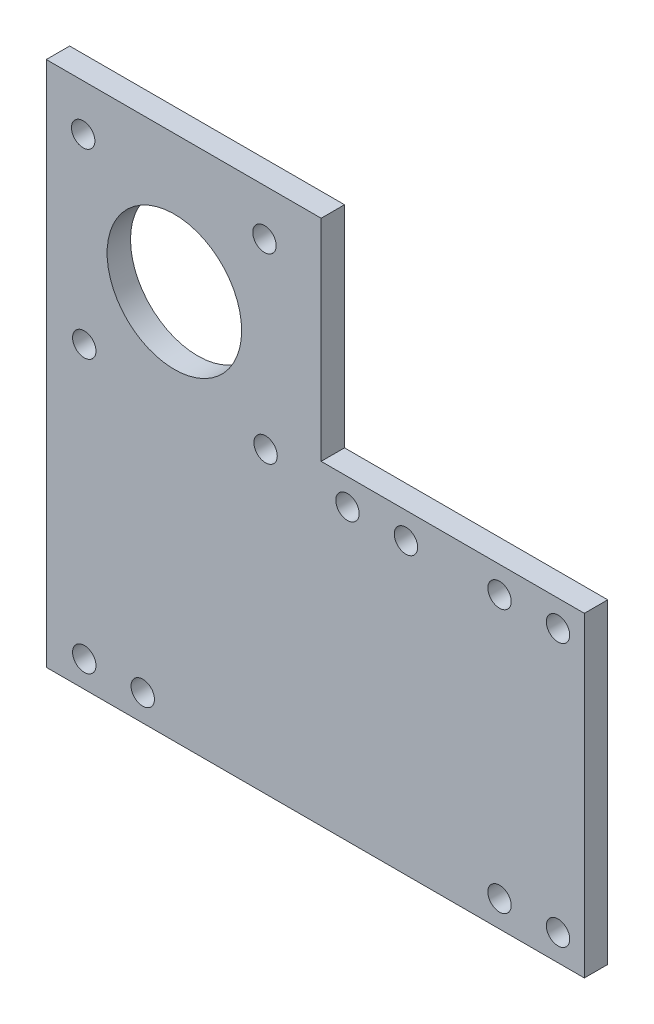
ISO-10303-21;
HEADER;
FILE_DESCRIPTION(('STEP AP214'),'2;1');
FILE_NAME('part.step','',(''),(''),'','','');
FILE_SCHEMA(('AUTOMOTIVE_DESIGN { 1 0 10303 214 1 1 1 1 }'));
ENDSEC;
DATA;
#1=APPLICATION_CONTEXT('core data for automotive mechanical design processes');
#2=APPLICATION_PROTOCOL_DEFINITION('international standard','automotive_design',2000,#1);
#3=PRODUCT_CONTEXT('',#1,'mechanical');
#4=PRODUCT('Part','Part','',(#3));
#5=PRODUCT_RELATED_PRODUCT_CATEGORY('part','',(#4));
#6=PRODUCT_DEFINITION_FORMATION('','',#4);
#7=PRODUCT_DEFINITION_CONTEXT('part definition',#1,'design');
#8=PRODUCT_DEFINITION('design','',#6,#7);
#9=PRODUCT_DEFINITION_SHAPE('','',#8);
#10=(LENGTH_UNIT() NAMED_UNIT(*) SI_UNIT(.MILLI.,.METRE.));
#11=(NAMED_UNIT(*) PLANE_ANGLE_UNIT() SI_UNIT($,.RADIAN.));
#12=(NAMED_UNIT(*) SI_UNIT($,.STERADIAN.) SOLID_ANGLE_UNIT());
#13=UNCERTAINTY_MEASURE_WITH_UNIT(LENGTH_MEASURE(1.E-05),#10,'distance_accuracy_value','');
#14=(GEOMETRIC_REPRESENTATION_CONTEXT(3) GLOBAL_UNCERTAINTY_ASSIGNED_CONTEXT((#13)) GLOBAL_UNIT_ASSIGNED_CONTEXT((#10,
#11,#12)) REPRESENTATION_CONTEXT('',''));
#15=CARTESIAN_POINT('',(0.,0.,0.));
#16=DIRECTION('',(0.,0.,1.));
#17=DIRECTION('',(1.,0.,0.));
#18=AXIS2_PLACEMENT_3D('',#15,#16,#17);
#19=CARTESIAN_POINT('',(45.,-27.,4.));
#20=DIRECTION('',(-1.,0.,0.));
#21=DIRECTION('',(0.,0.,1.));
#22=AXIS2_PLACEMENT_3D('',#19,#20,#21);
#23=PLANE('',#22);
#24=DIRECTION('',(0.,1.,0.));
#25=VECTOR('',#24,1.);
#26=CARTESIAN_POINT('',(45.,-27.,0.));
#27=LINE('',#26,#25);
#28=CARTESIAN_POINT('',(45.,-27.,0.));
#29=VERTEX_POINT('',#28);
#30=CARTESIAN_POINT('',(45.,27.,0.));
#31=VERTEX_POINT('',#30);
#32=EDGE_CURVE('E184',#29,#31,#27,.T.);
#33=ORIENTED_EDGE('',*,*,#32,.T.);
#34=DIRECTION('',(0.,0.,-1.));
#35=VECTOR('',#34,1.);
#36=CARTESIAN_POINT('',(45.,27.,4.));
#37=LINE('',#36,#35);
#38=CARTESIAN_POINT('',(45.,27.,4.));
#39=VERTEX_POINT('',#38);
#40=EDGE_CURVE('E11',#39,#31,#37,.T.);
#41=ORIENTED_EDGE('',*,*,#40,.F.);
#42=DIRECTION('',(0.,1.,0.));
#43=VECTOR('',#42,1.);
#44=CARTESIAN_POINT('',(45.,-27.,4.));
#45=LINE('',#44,#43);
#46=CARTESIAN_POINT('',(45.,-27.,4.));
#47=VERTEX_POINT('',#46);
#48=EDGE_CURVE('E187',#47,#39,#45,.T.);
#49=ORIENTED_EDGE('',*,*,#48,.F.);
#50=DIRECTION('',(0.,0.,-1.));
#51=VECTOR('',#50,1.);
#52=CARTESIAN_POINT('',(45.,-27.,4.));
#53=LINE('',#52,#51);
#54=EDGE_CURVE('E195',#47,#29,#53,.T.);
#55=ORIENTED_EDGE('',*,*,#54,.T.);
#56=EDGE_LOOP('',(#33,#41,#49,#55));
#57=FACE_BOUND('',#56,.T.);
#58=ADVANCED_FACE('F35',(#57),#23,.F.);
#59=CARTESIAN_POINT('',(0.,27.,4.));
#60=DIRECTION('',(0.,-1.,0.));
#61=DIRECTION('',(0.,0.,-1.));
#62=AXIS2_PLACEMENT_3D('',#59,#60,#61);
#63=PLANE('',#62);
#64=DIRECTION('',(-1.,0.,0.));
#65=VECTOR('',#64,1.);
#66=CARTESIAN_POINT('',(0.,27.,0.));
#67=LINE('',#66,#65);
#68=CARTESIAN_POINT('',(0.,27.,0.));
#69=VERTEX_POINT('',#68);
#70=EDGE_CURVE('E198',#31,#69,#67,.T.);
#71=ORIENTED_EDGE('',*,*,#70,.T.);
#72=DIRECTION('',(0.,0.,-1.));
#73=VECTOR('',#72,1.);
#74=CARTESIAN_POINT('',(0.,27.,4.));
#75=LINE('',#74,#73);
#76=CARTESIAN_POINT('',(0.,27.,4.));
#77=VERTEX_POINT('',#76);
#78=EDGE_CURVE('E44',#77,#69,#75,.T.);
#79=ORIENTED_EDGE('',*,*,#78,.F.);
#80=DIRECTION('',(-1.,0.,0.));
#81=VECTOR('',#80,1.);
#82=CARTESIAN_POINT('',(0.,27.,4.));
#83=LINE('',#82,#81);
#84=EDGE_CURVE('E85',#39,#77,#83,.T.);
#85=ORIENTED_EDGE('',*,*,#84,.F.);
#86=ORIENTED_EDGE('',*,*,#40,.T.);
#87=EDGE_LOOP('',(#71,#79,#85,#86));
#88=FACE_BOUND('',#87,.T.);
#89=ADVANCED_FACE('F207',(#88),#63,.F.);
#90=CARTESIAN_POINT('',(0.,63.,4.));
#91=DIRECTION('',(-1.,0.,0.));
#92=DIRECTION('',(0.,-1.,0.));
#93=AXIS2_PLACEMENT_3D('',#90,#91,#92);
#94=PLANE('',#93);
#95=DIRECTION('',(0.,1.,0.));
#96=VECTOR('',#95,1.);
#97=CARTESIAN_POINT('',(0.,63.,0.));
#98=LINE('',#97,#96);
#99=CARTESIAN_POINT('',(0.,63.,0.));
#100=VERTEX_POINT('',#99);
#101=EDGE_CURVE('E71',#69,#100,#98,.T.);
#102=ORIENTED_EDGE('',*,*,#101,.T.);
#103=DIRECTION('',(0.,0.,-1.));
#104=VECTOR('',#103,1.);
#105=CARTESIAN_POINT('',(0.,63.,4.));
#106=LINE('',#105,#104);
#107=CARTESIAN_POINT('',(0.,63.,4.));
#108=VERTEX_POINT('',#107);
#109=EDGE_CURVE('E104',#108,#100,#106,.T.);
#110=ORIENTED_EDGE('',*,*,#109,.F.);
#111=DIRECTION('',(0.,1.,0.));
#112=VECTOR('',#111,1.);
#113=CARTESIAN_POINT('',(0.,63.,4.));
#114=LINE('',#113,#112);
#115=EDGE_CURVE('E190',#77,#108,#114,.T.);
#116=ORIENTED_EDGE('',*,*,#115,.F.);
#117=ORIENTED_EDGE('',*,*,#78,.T.);
#118=EDGE_LOOP('',(#102,#110,#116,#117));
#119=FACE_BOUND('',#118,.T.);
#120=ADVANCED_FACE('F205',(#119),#94,.F.);
#121=CARTESIAN_POINT('',(-45.,63.,4.));
#122=DIRECTION('',(0.,-1.,0.));
#123=DIRECTION('',(0.,0.,-1.));
#124=AXIS2_PLACEMENT_3D('',#121,#122,#123);
#125=PLANE('',#124);
#126=DIRECTION('',(-1.,0.,0.));
#127=VECTOR('',#126,1.);
#128=CARTESIAN_POINT('',(-45.,63.,0.));
#129=LINE('',#128,#127);
#130=CARTESIAN_POINT('',(-47.,63.,0.));
#131=VERTEX_POINT('',#130);
#132=EDGE_CURVE('E98',#100,#131,#129,.T.);
#133=ORIENTED_EDGE('',*,*,#132,.T.);
#134=DIRECTION('',(0.,0.,1.));
#135=VECTOR('',#134,1.);
#136=CARTESIAN_POINT('',(-47.,63.,0.));
#137=LINE('',#136,#135);
#138=CARTESIAN_POINT('',(-47.,63.,4.));
#139=VERTEX_POINT('',#138);
#140=EDGE_CURVE('E102',#131,#139,#137,.T.);
#141=ORIENTED_EDGE('',*,*,#140,.T.);
#142=DIRECTION('',(-1.,0.,0.));
#143=VECTOR('',#142,1.);
#144=CARTESIAN_POINT('',(-45.,63.,4.));
#145=LINE('',#144,#143);
#146=EDGE_CURVE('E192',#108,#139,#145,.T.);
#147=ORIENTED_EDGE('',*,*,#146,.F.);
#148=ORIENTED_EDGE('',*,*,#109,.T.);
#149=EDGE_LOOP('',(#133,#141,#147,#148));
#150=FACE_BOUND('',#149,.T.);
#151=ADVANCED_FACE('F100',(#150),#125,.F.);
#152=CARTESIAN_POINT('',(-45.,-27.,4.));
#153=DIRECTION('',(0.,1.,0.));
#154=DIRECTION('',(0.,0.,1.));
#155=AXIS2_PLACEMENT_3D('',#152,#153,#154);
#156=PLANE('',#155);
#157=DIRECTION('',(1.,0.,0.));
#158=VECTOR('',#157,1.);
#159=CARTESIAN_POINT('',(-45.,-27.,0.));
#160=LINE('',#159,#158);
#161=CARTESIAN_POINT('',(-47.,-27.,0.));
#162=VERTEX_POINT('',#161);
#163=EDGE_CURVE('E78',#162,#29,#160,.T.);
#164=ORIENTED_EDGE('',*,*,#163,.T.);
#165=ORIENTED_EDGE('',*,*,#54,.F.);
#166=DIRECTION('',(1.,0.,0.));
#167=VECTOR('',#166,1.);
#168=CARTESIAN_POINT('',(-45.,-27.,4.));
#169=LINE('',#168,#167);
#170=CARTESIAN_POINT('',(-47.,-27.,4.));
#171=VERTEX_POINT('',#170);
#172=EDGE_CURVE('E52',#171,#47,#169,.T.);
#173=ORIENTED_EDGE('',*,*,#172,.F.);
#174=DIRECTION('',(0.,0.,1.));
#175=VECTOR('',#174,1.);
#176=CARTESIAN_POINT('',(-47.,-27.,0.));
#177=LINE('',#176,#175);
#178=EDGE_CURVE('E114',#162,#171,#177,.T.);
#179=ORIENTED_EDGE('',*,*,#178,.F.);
#180=EDGE_LOOP('',(#164,#165,#173,#179));
#181=FACE_BOUND('',#180,.T.);
#182=ADVANCED_FACE('F210',(#181),#156,.F.);
#183=CARTESIAN_POINT('',(0.,0.,4.));
#184=DIRECTION('',(0.,0.,-1.));
#185=DIRECTION('',(-1.,0.,0.));
#186=AXIS2_PLACEMENT_3D('',#183,#184,#185);
#187=PLANE('',#186);
#188=CARTESIAN_POINT('',(-25.0954366896492,39.5576895954221,4.));
#189=DIRECTION('',(0.,0.,1.));
#190=DIRECTION('',(1.,0.,0.));
#191=AXIS2_PLACEMENT_3D('',#188,#189,#190);
#192=CIRCLE('',#191,11.5);
#193=CARTESIAN_POINT('',(-13.5954366896492,39.5576895954221,4.));
#194=VERTEX_POINT('',#193);
#195=EDGE_CURVE('E474',#194,#194,#192,.T.);
#196=ORIENTED_EDGE('',*,*,#195,.F.);
#197=EDGE_LOOP('',(#196));
#198=FACE_BOUND('',#197,.T.);
#199=CARTESIAN_POINT('',(14.5,22.5,4.));
#200=DIRECTION('',(0.,0.,1.));
#201=DIRECTION('',(1.,0.,0.));
#202=AXIS2_PLACEMENT_3D('',#199,#200,#201);
#203=CIRCLE('',#202,2.);
#204=CARTESIAN_POINT('',(16.5,22.5,4.));
#205=VERTEX_POINT('',#204);
#206=EDGE_CURVE('E476',#205,#205,#203,.T.);
#207=ORIENTED_EDGE('',*,*,#206,.F.);
#208=EDGE_LOOP('',(#207));
#209=FACE_BOUND('',#208,.T.);
#210=CARTESIAN_POINT('',(4.50000000000001,22.5,4.));
#211=DIRECTION('',(0.,0.,1.));
#212=DIRECTION('',(1.,0.,0.));
#213=AXIS2_PLACEMENT_3D('',#210,#211,#212);
#214=CIRCLE('',#213,2.);
#215=CARTESIAN_POINT('',(6.50000000000002,22.5,4.));
#216=VERTEX_POINT('',#215);
#217=EDGE_CURVE('E122',#216,#216,#214,.T.);
#218=ORIENTED_EDGE('',*,*,#217,.F.);
#219=EDGE_LOOP('',(#218));
#220=FACE_BOUND('',#219,.T.);
#221=CARTESIAN_POINT('',(-9.69083877229573,55.0808500842383,4.));
#222=DIRECTION('',(0.,0.,1.));
#223=DIRECTION('',(1.,0.,0.));
#224=AXIS2_PLACEMENT_3D('',#221,#222,#223);
#225=CIRCLE('',#224,2.);
#226=CARTESIAN_POINT('',(-7.69083877229573,55.0808500842383,4.));
#227=VERTEX_POINT('',#226);
#228=EDGE_CURVE('E125',#227,#227,#225,.T.);
#229=ORIENTED_EDGE('',*,*,#228,.F.);
#230=EDGE_LOOP('',(#229));
#231=FACE_BOUND('',#230,.T.);
#232=CARTESIAN_POINT('',(-40.6908387722957,55.0808500842383,4.));
#233=DIRECTION('',(0.,0.,1.));
#234=DIRECTION('',(1.,0.,0.));
#235=AXIS2_PLACEMENT_3D('',#232,#233,#234);
#236=CIRCLE('',#235,2.);
#237=CARTESIAN_POINT('',(-38.6908387722957,55.0808500842383,4.));
#238=VERTEX_POINT('',#237);
#239=EDGE_CURVE('E130',#238,#238,#236,.T.);
#240=ORIENTED_EDGE('',*,*,#239,.F.);
#241=EDGE_LOOP('',(#240));
#242=FACE_BOUND('',#241,.T.);
#243=CARTESIAN_POINT('',(-9.50003460700268,24.0345291066058,4.));
#244=DIRECTION('',(0.,0.,1.));
#245=DIRECTION('',(1.,0.,0.));
#246=AXIS2_PLACEMENT_3D('',#243,#244,#245);
#247=CIRCLE('',#246,2.00000000000001);
#248=CARTESIAN_POINT('',(-7.50003460700267,24.0345291066058,4.));
#249=VERTEX_POINT('',#248);
#250=EDGE_CURVE('E136',#249,#249,#247,.T.);
#251=ORIENTED_EDGE('',*,*,#250,.F.);
#252=EDGE_LOOP('',(#251));
#253=FACE_BOUND('',#252,.T.);
#254=CARTESIAN_POINT('',(-40.5,24.0808500842383,4.));
#255=DIRECTION('',(0.,0.,1.));
#256=DIRECTION('',(1.,0.,0.));
#257=AXIS2_PLACEMENT_3D('',#254,#255,#256);
#258=CIRCLE('',#257,2.);
#259=CARTESIAN_POINT('',(-38.5,24.0808500842383,4.));
#260=VERTEX_POINT('',#259);
#261=EDGE_CURVE('E142',#260,#260,#258,.T.);
#262=ORIENTED_EDGE('',*,*,#261,.F.);
#263=EDGE_LOOP('',(#262));
#264=FACE_BOUND('',#263,.T.);
#265=CARTESIAN_POINT('',(40.5,22.5,4.));
#266=DIRECTION('',(0.,0.,1.));
#267=DIRECTION('',(-1.,0.,0.));
#268=AXIS2_PLACEMENT_3D('',#265,#266,#267);
#269=CIRCLE('',#268,2.);
#270=CARTESIAN_POINT('',(38.5,22.5,4.));
#271=VERTEX_POINT('',#270);
#272=EDGE_CURVE('E148',#271,#271,#269,.T.);
#273=ORIENTED_EDGE('',*,*,#272,.F.);
#274=EDGE_LOOP('',(#273));
#275=FACE_BOUND('',#274,.T.);
#276=CARTESIAN_POINT('',(30.5,22.5,4.));
#277=DIRECTION('',(0.,0.,1.));
#278=DIRECTION('',(-1.,0.,0.));
#279=AXIS2_PLACEMENT_3D('',#276,#277,#278);
#280=CIRCLE('',#279,2.);
#281=CARTESIAN_POINT('',(28.5,22.5,4.));
#282=VERTEX_POINT('',#281);
#283=EDGE_CURVE('E161',#282,#282,#280,.T.);
#284=ORIENTED_EDGE('',*,*,#283,.F.);
#285=EDGE_LOOP('',(#284));
#286=FACE_BOUND('',#285,.T.);
#287=CARTESIAN_POINT('',(40.5,-22.5,4.));
#288=DIRECTION('',(0.,0.,1.));
#289=DIRECTION('',(-1.,0.,0.));
#290=AXIS2_PLACEMENT_3D('',#287,#288,#289);
#291=CIRCLE('',#290,2.);
#292=CARTESIAN_POINT('',(38.5,-22.5,4.));
#293=VERTEX_POINT('',#292);
#294=EDGE_CURVE('E155',#293,#293,#291,.T.);
#295=ORIENTED_EDGE('',*,*,#294,.F.);
#296=EDGE_LOOP('',(#295));
#297=FACE_BOUND('',#296,.T.);
#298=CARTESIAN_POINT('',(30.5,-22.5,4.));
#299=DIRECTION('',(0.,0.,1.));
#300=DIRECTION('',(-1.,0.,0.));
#301=AXIS2_PLACEMENT_3D('',#298,#299,#300);
#302=CIRCLE('',#301,2.);
#303=CARTESIAN_POINT('',(28.5,-22.5,4.));
#304=VERTEX_POINT('',#303);
#305=EDGE_CURVE('E154',#304,#304,#302,.T.);
#306=ORIENTED_EDGE('',*,*,#305,.F.);
#307=EDGE_LOOP('',(#306));
#308=FACE_BOUND('',#307,.T.);
#309=CARTESIAN_POINT('',(-30.5,-22.5,4.));
#310=DIRECTION('',(0.,0.,1.));
#311=DIRECTION('',(1.,0.,0.));
#312=AXIS2_PLACEMENT_3D('',#309,#310,#311);
#313=CIRCLE('',#312,2.);
#314=CARTESIAN_POINT('',(-28.5,-22.5,4.));
#315=VERTEX_POINT('',#314);
#316=EDGE_CURVE('E173',#315,#315,#313,.T.);
#317=ORIENTED_EDGE('',*,*,#316,.F.);
#318=EDGE_LOOP('',(#317));
#319=FACE_BOUND('',#318,.T.);
#320=CARTESIAN_POINT('',(-40.5,-22.5,4.));
#321=DIRECTION('',(0.,0.,1.));
#322=DIRECTION('',(1.,0.,0.));
#323=AXIS2_PLACEMENT_3D('',#320,#321,#322);
#324=CIRCLE('',#323,2.);
#325=CARTESIAN_POINT('',(-38.5,-22.5,4.));
#326=VERTEX_POINT('',#325);
#327=EDGE_CURVE('E172',#326,#326,#324,.T.);
#328=ORIENTED_EDGE('',*,*,#327,.F.);
#329=EDGE_LOOP('',(#328));
#330=FACE_BOUND('',#329,.T.);
#331=ORIENTED_EDGE('',*,*,#48,.T.);
#332=ORIENTED_EDGE('',*,*,#84,.T.);
#333=ORIENTED_EDGE('',*,*,#115,.T.);
#334=ORIENTED_EDGE('',*,*,#146,.T.);
#335=DIRECTION('',(0.,-1.,0.));
#336=VECTOR('',#335,1.);
#337=CARTESIAN_POINT('',(-47.,63.,4.));
#338=LINE('',#337,#336);
#339=EDGE_CURVE('E113',#139,#171,#338,.T.);
#340=ORIENTED_EDGE('',*,*,#339,.T.);
#341=ORIENTED_EDGE('',*,*,#172,.T.);
#342=EDGE_LOOP('',(#331,#332,#333,#334,#340,#341));
#343=FACE_BOUND('',#342,.T.);
#344=ADVANCED_FACE('F211',(#198,#209,#220,#231,#242,#253,#264,#275,#286,#297,#308,#319,#330,
#343),#187,.F.);
#345=CARTESIAN_POINT('',(0.,0.,0.));
#346=DIRECTION('',(0.,0.,-1.));
#347=DIRECTION('',(-1.,0.,0.));
#348=AXIS2_PLACEMENT_3D('',#345,#346,#347);
#349=PLANE('',#348);
#350=CARTESIAN_POINT('',(-25.0954366896492,39.5576895954221,0.));
#351=DIRECTION('',(0.,0.,-1.));
#352=DIRECTION('',(-1.,0.,0.));
#353=AXIS2_PLACEMENT_3D('',#350,#351,#352);
#354=CIRCLE('',#353,11.5);
#355=CARTESIAN_POINT('',(-36.5954366896492,39.5576895954221,0.));
#356=VERTEX_POINT('',#355);
#357=EDGE_CURVE('E38',#356,#356,#354,.T.);
#358=ORIENTED_EDGE('',*,*,#357,.F.);
#359=EDGE_LOOP('',(#358));
#360=FACE_BOUND('',#359,.T.);
#361=CARTESIAN_POINT('',(14.5,22.5,0.));
#362=DIRECTION('',(0.,0.,1.));
#363=DIRECTION('',(1.,0.,0.));
#364=AXIS2_PLACEMENT_3D('',#361,#362,#363);
#365=CIRCLE('',#364,2.);
#366=CARTESIAN_POINT('',(16.5,22.5,0.));
#367=VERTEX_POINT('',#366);
#368=EDGE_CURVE('E478',#367,#367,#365,.T.);
#369=ORIENTED_EDGE('',*,*,#368,.T.);
#370=EDGE_LOOP('',(#369));
#371=FACE_BOUND('',#370,.T.);
#372=CARTESIAN_POINT('',(4.50000000000001,22.5,0.));
#373=DIRECTION('',(0.,0.,1.));
#374=DIRECTION('',(1.,0.,0.));
#375=AXIS2_PLACEMENT_3D('',#372,#373,#374);
#376=CIRCLE('',#375,2.);
#377=CARTESIAN_POINT('',(6.50000000000002,22.5,0.));
#378=VERTEX_POINT('',#377);
#379=EDGE_CURVE('E119',#378,#378,#376,.T.);
#380=ORIENTED_EDGE('',*,*,#379,.T.);
#381=EDGE_LOOP('',(#380));
#382=FACE_BOUND('',#381,.T.);
#383=CARTESIAN_POINT('',(-9.69083877229573,55.0808500842383,0.));
#384=DIRECTION('',(0.,0.,1.));
#385=DIRECTION('',(1.,0.,0.));
#386=AXIS2_PLACEMENT_3D('',#383,#384,#385);
#387=CIRCLE('',#386,2.);
#388=CARTESIAN_POINT('',(-7.69083877229573,55.0808500842383,0.));
#389=VERTEX_POINT('',#388);
#390=EDGE_CURVE('E127',#389,#389,#387,.T.);
#391=ORIENTED_EDGE('',*,*,#390,.T.);
#392=EDGE_LOOP('',(#391));
#393=FACE_BOUND('',#392,.T.);
#394=CARTESIAN_POINT('',(-40.6908387722957,55.0808500842383,0.));
#395=DIRECTION('',(0.,0.,1.));
#396=DIRECTION('',(1.,0.,0.));
#397=AXIS2_PLACEMENT_3D('',#394,#395,#396);
#398=CIRCLE('',#397,2.);
#399=CARTESIAN_POINT('',(-38.6908387722957,55.0808500842383,0.));
#400=VERTEX_POINT('',#399);
#401=EDGE_CURVE('E133',#400,#400,#398,.T.);
#402=ORIENTED_EDGE('',*,*,#401,.T.);
#403=EDGE_LOOP('',(#402));
#404=FACE_BOUND('',#403,.T.);
#405=CARTESIAN_POINT('',(-9.50003460700268,24.0345291066058,0.));
#406=DIRECTION('',(0.,0.,1.));
#407=DIRECTION('',(1.,0.,0.));
#408=AXIS2_PLACEMENT_3D('',#405,#406,#407);
#409=CIRCLE('',#408,2.00000000000001);
#410=CARTESIAN_POINT('',(-7.50003460700267,24.0345291066058,0.));
#411=VERTEX_POINT('',#410);
#412=EDGE_CURVE('E139',#411,#411,#409,.T.);
#413=ORIENTED_EDGE('',*,*,#412,.T.);
#414=EDGE_LOOP('',(#413));
#415=FACE_BOUND('',#414,.T.);
#416=CARTESIAN_POINT('',(-40.5,24.0808500842383,0.));
#417=DIRECTION('',(0.,0.,1.));
#418=DIRECTION('',(1.,0.,0.));
#419=AXIS2_PLACEMENT_3D('',#416,#417,#418);
#420=CIRCLE('',#419,2.);
#421=CARTESIAN_POINT('',(-38.5,24.0808500842383,0.));
#422=VERTEX_POINT('',#421);
#423=EDGE_CURVE('E145',#422,#422,#420,.T.);
#424=ORIENTED_EDGE('',*,*,#423,.T.);
#425=EDGE_LOOP('',(#424));
#426=FACE_BOUND('',#425,.T.);
#427=CARTESIAN_POINT('',(40.5,22.5,0.));
#428=DIRECTION('',(0.,0.,1.));
#429=DIRECTION('',(-1.,0.,0.));
#430=AXIS2_PLACEMENT_3D('',#427,#428,#429);
#431=CIRCLE('',#430,2.);
#432=CARTESIAN_POINT('',(38.5,22.5,0.));
#433=VERTEX_POINT('',#432);
#434=EDGE_CURVE('E164',#433,#433,#431,.T.);
#435=ORIENTED_EDGE('',*,*,#434,.T.);
#436=EDGE_LOOP('',(#435));
#437=FACE_BOUND('',#436,.T.);
#438=CARTESIAN_POINT('',(30.5,22.5,0.));
#439=DIRECTION('',(0.,0.,1.));
#440=DIRECTION('',(-1.,0.,0.));
#441=AXIS2_PLACEMENT_3D('',#438,#439,#440);
#442=CIRCLE('',#441,2.);
#443=CARTESIAN_POINT('',(28.5,22.5,0.));
#444=VERTEX_POINT('',#443);
#445=EDGE_CURVE('E158',#444,#444,#442,.T.);
#446=ORIENTED_EDGE('',*,*,#445,.T.);
#447=EDGE_LOOP('',(#446));
#448=FACE_BOUND('',#447,.T.);
#449=CARTESIAN_POINT('',(40.5,-22.5,0.));
#450=DIRECTION('',(0.,0.,1.));
#451=DIRECTION('',(-1.,0.,0.));
#452=AXIS2_PLACEMENT_3D('',#449,#450,#451);
#453=CIRCLE('',#452,2.);
#454=CARTESIAN_POINT('',(38.5,-22.5,0.));
#455=VERTEX_POINT('',#454);
#456=EDGE_CURVE('E151',#455,#455,#453,.T.);
#457=ORIENTED_EDGE('',*,*,#456,.T.);
#458=EDGE_LOOP('',(#457));
#459=FACE_BOUND('',#458,.T.);
#460=CARTESIAN_POINT('',(30.5,-22.5,0.));
#461=DIRECTION('',(0.,0.,1.));
#462=DIRECTION('',(-1.,0.,0.));
#463=AXIS2_PLACEMENT_3D('',#460,#461,#462);
#464=CIRCLE('',#463,2.);
#465=CARTESIAN_POINT('',(28.5,-22.5,0.));
#466=VERTEX_POINT('',#465);
#467=EDGE_CURVE('E176',#466,#466,#464,.T.);
#468=ORIENTED_EDGE('',*,*,#467,.T.);
#469=EDGE_LOOP('',(#468));
#470=FACE_BOUND('',#469,.T.);
#471=CARTESIAN_POINT('',(-30.5,-22.5,0.));
#472=DIRECTION('',(0.,0.,1.));
#473=DIRECTION('',(1.,0.,0.));
#474=AXIS2_PLACEMENT_3D('',#471,#472,#473);
#475=CIRCLE('',#474,2.);
#476=CARTESIAN_POINT('',(-28.5,-22.5,0.));
#477=VERTEX_POINT('',#476);
#478=EDGE_CURVE('E169',#477,#477,#475,.T.);
#479=ORIENTED_EDGE('',*,*,#478,.T.);
#480=EDGE_LOOP('',(#479));
#481=FACE_BOUND('',#480,.T.);
#482=CARTESIAN_POINT('',(-40.5,-22.5,0.));
#483=DIRECTION('',(0.,0.,1.));
#484=DIRECTION('',(1.,0.,0.));
#485=AXIS2_PLACEMENT_3D('',#482,#483,#484);
#486=CIRCLE('',#485,2.);
#487=CARTESIAN_POINT('',(-38.5,-22.5,0.));
#488=VERTEX_POINT('',#487);
#489=EDGE_CURVE('E181',#488,#488,#486,.T.);
#490=ORIENTED_EDGE('',*,*,#489,.T.);
#491=EDGE_LOOP('',(#490));
#492=FACE_BOUND('',#491,.T.);
#493=ORIENTED_EDGE('',*,*,#32,.F.);
#494=ORIENTED_EDGE('',*,*,#163,.F.);
#495=DIRECTION('',(0.,-1.,0.));
#496=VECTOR('',#495,1.);
#497=CARTESIAN_POINT('',(-47.,63.,0.));
#498=LINE('',#497,#496);
#499=EDGE_CURVE('E112',#131,#162,#498,.T.);
#500=ORIENTED_EDGE('',*,*,#499,.F.);
#501=ORIENTED_EDGE('',*,*,#132,.F.);
#502=ORIENTED_EDGE('',*,*,#101,.F.);
#503=ORIENTED_EDGE('',*,*,#70,.F.);
#504=EDGE_LOOP('',(#493,#494,#500,#501,#502,#503));
#505=FACE_BOUND('',#504,.T.);
#506=ADVANCED_FACE('F117',(#360,#371,#382,#393,#404,#415,#426,#437,#448,#459,#470,#481,#492,
#505),#349,.T.);
#507=CARTESIAN_POINT('',(-40.5,-22.5,0.));
#508=DIRECTION('',(0.,0.,1.));
#509=DIRECTION('',(1.,0.,0.));
#510=AXIS2_PLACEMENT_3D('',#507,#508,#509);
#511=CYLINDRICAL_SURFACE('',#510,2.);
#512=ORIENTED_EDGE('',*,*,#489,.F.);
#513=EDGE_LOOP('',(#512));
#514=FACE_BOUND('',#513,.T.);
#515=ORIENTED_EDGE('',*,*,#327,.T.);
#516=EDGE_LOOP('',(#515));
#517=FACE_BOUND('',#516,.T.);
#518=ADVANCED_FACE('F219',(#514,#517),#511,.F.);
#519=CARTESIAN_POINT('',(-30.5,-22.5,0.));
#520=DIRECTION('',(0.,0.,1.));
#521=DIRECTION('',(1.,0.,0.));
#522=AXIS2_PLACEMENT_3D('',#519,#520,#521);
#523=CYLINDRICAL_SURFACE('',#522,2.);
#524=ORIENTED_EDGE('',*,*,#478,.F.);
#525=EDGE_LOOP('',(#524));
#526=FACE_BOUND('',#525,.T.);
#527=ORIENTED_EDGE('',*,*,#316,.T.);
#528=EDGE_LOOP('',(#527));
#529=FACE_BOUND('',#528,.T.);
#530=ADVANCED_FACE('F333',(#526,#529),#523,.F.);
#531=CARTESIAN_POINT('',(30.5,-22.5,0.));
#532=DIRECTION('',(0.,0.,1.));
#533=DIRECTION('',(1.,0.,0.));
#534=AXIS2_PLACEMENT_3D('',#531,#532,#533);
#535=CYLINDRICAL_SURFACE('',#534,2.);
#536=ORIENTED_EDGE('',*,*,#467,.F.);
#537=EDGE_LOOP('',(#536));
#538=FACE_BOUND('',#537,.T.);
#539=ORIENTED_EDGE('',*,*,#305,.T.);
#540=EDGE_LOOP('',(#539));
#541=FACE_BOUND('',#540,.T.);
#542=ADVANCED_FACE('F325',(#538,#541),#535,.F.);
#543=CARTESIAN_POINT('',(40.5,-22.5,0.));
#544=DIRECTION('',(0.,0.,1.));
#545=DIRECTION('',(1.,0.,0.));
#546=AXIS2_PLACEMENT_3D('',#543,#544,#545);
#547=CYLINDRICAL_SURFACE('',#546,2.);
#548=ORIENTED_EDGE('',*,*,#456,.F.);
#549=EDGE_LOOP('',(#548));
#550=FACE_BOUND('',#549,.T.);
#551=ORIENTED_EDGE('',*,*,#294,.T.);
#552=EDGE_LOOP('',(#551));
#553=FACE_BOUND('',#552,.T.);
#554=ADVANCED_FACE('F321',(#550,#553),#547,.F.);
#555=CARTESIAN_POINT('',(30.5,22.5,0.));
#556=DIRECTION('',(0.,0.,1.));
#557=DIRECTION('',(1.,0.,0.));
#558=AXIS2_PLACEMENT_3D('',#555,#556,#557);
#559=CYLINDRICAL_SURFACE('',#558,2.);
#560=ORIENTED_EDGE('',*,*,#445,.F.);
#561=EDGE_LOOP('',(#560));
#562=FACE_BOUND('',#561,.T.);
#563=ORIENTED_EDGE('',*,*,#283,.T.);
#564=EDGE_LOOP('',(#563));
#565=FACE_BOUND('',#564,.T.);
#566=ADVANCED_FACE('F324',(#562,#565),#559,.F.);
#567=CARTESIAN_POINT('',(40.5,22.5,0.));
#568=DIRECTION('',(0.,0.,1.));
#569=DIRECTION('',(1.,0.,0.));
#570=AXIS2_PLACEMENT_3D('',#567,#568,#569);
#571=CYLINDRICAL_SURFACE('',#570,2.);
#572=ORIENTED_EDGE('',*,*,#434,.F.);
#573=EDGE_LOOP('',(#572));
#574=FACE_BOUND('',#573,.T.);
#575=ORIENTED_EDGE('',*,*,#272,.T.);
#576=EDGE_LOOP('',(#575));
#577=FACE_BOUND('',#576,.T.);
#578=ADVANCED_FACE('F319',(#574,#577),#571,.F.);
#579=CARTESIAN_POINT('',(-40.5,24.0808500842383,0.));
#580=DIRECTION('',(0.,0.,1.));
#581=DIRECTION('',(1.,0.,0.));
#582=AXIS2_PLACEMENT_3D('',#579,#580,#581);
#583=CYLINDRICAL_SURFACE('',#582,2.);
#584=ORIENTED_EDGE('',*,*,#423,.F.);
#585=EDGE_LOOP('',(#584));
#586=FACE_BOUND('',#585,.T.);
#587=ORIENTED_EDGE('',*,*,#261,.T.);
#588=EDGE_LOOP('',(#587));
#589=FACE_BOUND('',#588,.T.);
#590=ADVANCED_FACE('F315',(#586,#589),#583,.F.);
#591=CARTESIAN_POINT('',(-9.50003460700268,24.0345291066058,0.));
#592=DIRECTION('',(0.,0.,1.));
#593=DIRECTION('',(1.,0.,0.));
#594=AXIS2_PLACEMENT_3D('',#591,#592,#593);
#595=CYLINDRICAL_SURFACE('',#594,2.00000000000001);
#596=ORIENTED_EDGE('',*,*,#412,.F.);
#597=EDGE_LOOP('',(#596));
#598=FACE_BOUND('',#597,.T.);
#599=ORIENTED_EDGE('',*,*,#250,.T.);
#600=EDGE_LOOP('',(#599));
#601=FACE_BOUND('',#600,.T.);
#602=ADVANCED_FACE('F311',(#598,#601),#595,.F.);
#603=CARTESIAN_POINT('',(-40.6908387722957,55.0808500842383,0.));
#604=DIRECTION('',(0.,0.,1.));
#605=DIRECTION('',(1.,0.,0.));
#606=AXIS2_PLACEMENT_3D('',#603,#604,#605);
#607=CYLINDRICAL_SURFACE('',#606,2.);
#608=ORIENTED_EDGE('',*,*,#401,.F.);
#609=EDGE_LOOP('',(#608));
#610=FACE_BOUND('',#609,.T.);
#611=ORIENTED_EDGE('',*,*,#239,.T.);
#612=EDGE_LOOP('',(#611));
#613=FACE_BOUND('',#612,.T.);
#614=ADVANCED_FACE('F307',(#610,#613),#607,.F.);
#615=CARTESIAN_POINT('',(-9.69083877229573,55.0808500842383,0.));
#616=DIRECTION('',(0.,0.,1.));
#617=DIRECTION('',(1.,0.,0.));
#618=AXIS2_PLACEMENT_3D('',#615,#616,#617);
#619=CYLINDRICAL_SURFACE('',#618,2.);
#620=ORIENTED_EDGE('',*,*,#390,.F.);
#621=EDGE_LOOP('',(#620));
#622=FACE_BOUND('',#621,.T.);
#623=ORIENTED_EDGE('',*,*,#228,.T.);
#624=EDGE_LOOP('',(#623));
#625=FACE_BOUND('',#624,.T.);
#626=ADVANCED_FACE('F257',(#622,#625),#619,.F.);
#627=CARTESIAN_POINT('',(-47.,63.,0.));
#628=DIRECTION('',(-1.,0.,0.));
#629=DIRECTION('',(0.,-1.,0.));
#630=AXIS2_PLACEMENT_3D('',#627,#628,#629);
#631=PLANE('',#630);
#632=ORIENTED_EDGE('',*,*,#339,.F.);
#633=ORIENTED_EDGE('',*,*,#140,.F.);
#634=ORIENTED_EDGE('',*,*,#499,.T.);
#635=ORIENTED_EDGE('',*,*,#178,.T.);
#636=EDGE_LOOP('',(#632,#633,#634,#635));
#637=FACE_BOUND('',#636,.T.);
#638=ADVANCED_FACE('F110',(#637),#631,.T.);
#639=CARTESIAN_POINT('',(4.50000000000001,22.5,0.));
#640=DIRECTION('',(0.,0.,1.));
#641=DIRECTION('',(1.,0.,0.));
#642=AXIS2_PLACEMENT_3D('',#639,#640,#641);
#643=CYLINDRICAL_SURFACE('',#642,2.);
#644=ORIENTED_EDGE('',*,*,#379,.F.);
#645=EDGE_LOOP('',(#644));
#646=FACE_BOUND('',#645,.T.);
#647=ORIENTED_EDGE('',*,*,#217,.T.);
#648=EDGE_LOOP('',(#647));
#649=FACE_BOUND('',#648,.T.);
#650=ADVANCED_FACE('F256',(#646,#649),#643,.F.);
#651=CARTESIAN_POINT('',(14.5,22.5,0.));
#652=DIRECTION('',(0.,0.,1.));
#653=DIRECTION('',(1.,0.,0.));
#654=AXIS2_PLACEMENT_3D('',#651,#652,#653);
#655=CYLINDRICAL_SURFACE('',#654,2.);
#656=ORIENTED_EDGE('',*,*,#368,.F.);
#657=EDGE_LOOP('',(#656));
#658=FACE_BOUND('',#657,.T.);
#659=ORIENTED_EDGE('',*,*,#206,.T.);
#660=EDGE_LOOP('',(#659));
#661=FACE_BOUND('',#660,.T.);
#662=ADVANCED_FACE('F268',(#658,#661),#655,.F.);
#663=CARTESIAN_POINT('',(-25.0954366896492,39.5576895954221,-6.));
#664=DIRECTION('',(0.,0.,1.));
#665=DIRECTION('',(1.,0.,0.));
#666=AXIS2_PLACEMENT_3D('',#663,#664,#665);
#667=CYLINDRICAL_SURFACE('',#666,11.5);
#668=ORIENTED_EDGE('',*,*,#357,.T.);
#669=EDGE_LOOP('',(#668));
#670=FACE_BOUND('',#669,.T.);
#671=ORIENTED_EDGE('',*,*,#195,.T.);
#672=EDGE_LOOP('',(#671));
#673=FACE_BOUND('',#672,.T.);
#674=ADVANCED_FACE('F277',(#670,#673),#667,.F.);
#675=CLOSED_SHELL('',(#58,#89,#120,#151,#182,#344,#506,#518,#530,#542,#554,#566,#578,#590,#602,
#614,#626,#638,#650,#662,#674));
#676=MANIFOLD_SOLID_BREP('B2',#675);
#677=ADVANCED_BREP_SHAPE_REPRESENTATION('',(#18,#676),#14);
#678=SHAPE_DEFINITION_REPRESENTATION(#9,#677);
ENDSEC;
END-ISO-10303-21;
